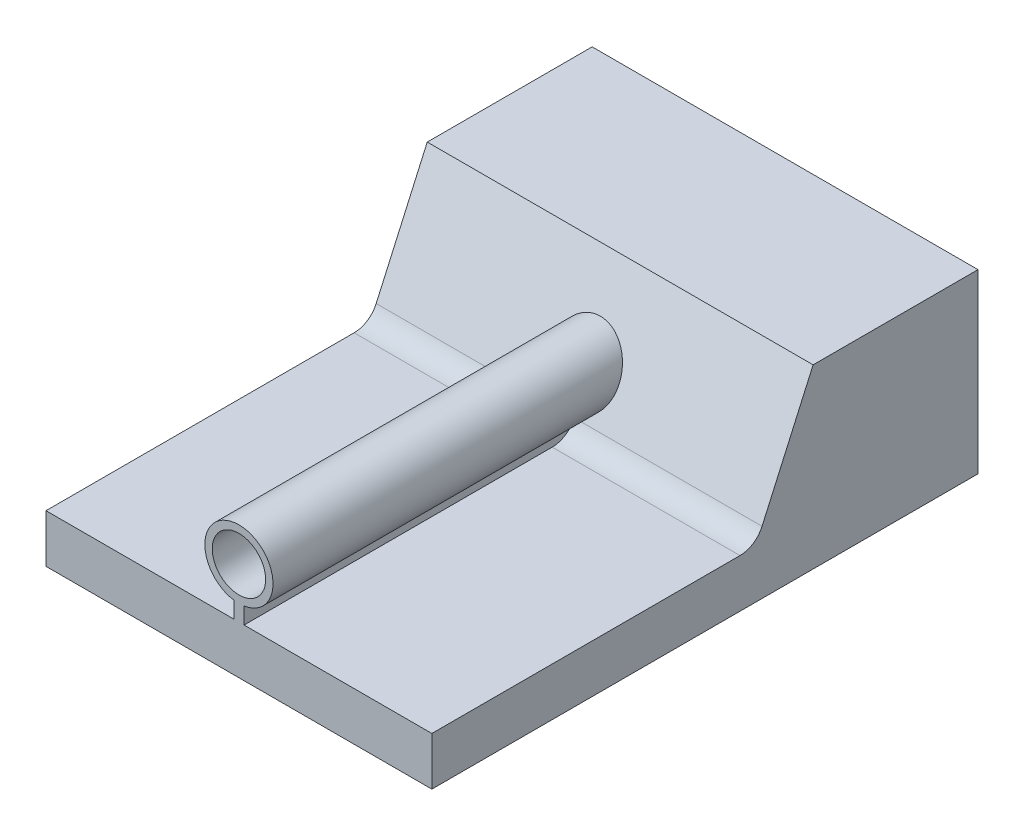
ISO-10303-21;
HEADER;
FILE_DESCRIPTION(('STEP AP214'),'2;1');
FILE_NAME('part.step','',(''),(''),'','','');
FILE_SCHEMA(('AUTOMOTIVE_DESIGN { 1 0 10303 214 1 1 1 1 }'));
ENDSEC;
DATA;
#1=APPLICATION_CONTEXT('core data for automotive mechanical design processes');
#2=APPLICATION_PROTOCOL_DEFINITION('international standard','automotive_design',2000,#1);
#3=PRODUCT_CONTEXT('',#1,'mechanical');
#4=PRODUCT('Part','Part','',(#3));
#5=PRODUCT_RELATED_PRODUCT_CATEGORY('part','',(#4));
#6=PRODUCT_DEFINITION_FORMATION('','',#4);
#7=PRODUCT_DEFINITION_CONTEXT('part definition',#1,'design');
#8=PRODUCT_DEFINITION('design','',#6,#7);
#9=PRODUCT_DEFINITION_SHAPE('','',#8);
#10=(LENGTH_UNIT() NAMED_UNIT(*) SI_UNIT(.MILLI.,.METRE.));
#11=(NAMED_UNIT(*) PLANE_ANGLE_UNIT() SI_UNIT($,.RADIAN.));
#12=(NAMED_UNIT(*) SI_UNIT($,.STERADIAN.) SOLID_ANGLE_UNIT());
#13=UNCERTAINTY_MEASURE_WITH_UNIT(LENGTH_MEASURE(1.E-05),#10,'distance_accuracy_value','');
#14=(GEOMETRIC_REPRESENTATION_CONTEXT(3) GLOBAL_UNCERTAINTY_ASSIGNED_CONTEXT((#13)) GLOBAL_UNIT_ASSIGNED_CONTEXT((#10,
#11,#12)) REPRESENTATION_CONTEXT('',''));
#15=CARTESIAN_POINT('',(0.,0.,0.));
#16=DIRECTION('',(0.,0.,1.));
#17=DIRECTION('',(1.,0.,0.));
#18=AXIS2_PLACEMENT_3D('',#15,#16,#17);
#19=CARTESIAN_POINT('',(76.2,9.52500000000001,-63.9427846483465));
#20=DIRECTION('',(0.,-1.,0.));
#21=DIRECTION('',(0.,0.,-1.));
#22=AXIS2_PLACEMENT_3D('',#19,#20,#21);
#23=PLANE('',#22);
#24=DIRECTION('',(0.,0.,1.));
#25=VECTOR('',#24,1.);
#26=CARTESIAN_POINT('',(37.084,9.525,-500000.));
#27=LINE('',#26,#25);
#28=CARTESIAN_POINT('',(37.084,9.525,-60.8457597954271));
#29=VERTEX_POINT('',#28);
#30=CARTESIAN_POINT('',(37.084,9.525,0.));
#31=VERTEX_POINT('',#30);
#32=EDGE_CURVE('E206',#29,#31,#27,.T.);
#33=ORIENTED_EDGE('',*,*,#32,.F.);
#34=DIRECTION('',(-1.,0.,0.));
#35=VECTOR('',#34,1.);
#36=CARTESIAN_POINT('',(0.,9.52500000000001,-60.8457597953329));
#37=LINE('',#36,#35);
#38=CARTESIAN_POINT('',(0.,9.52500000000001,-60.8457597953329));
#39=VERTEX_POINT('',#38);
#40=EDGE_CURVE('E253',#29,#39,#37,.T.);
#41=ORIENTED_EDGE('',*,*,#40,.T.);
#42=DIRECTION('',(0.,0.,1.));
#43=VECTOR('',#42,1.);
#44=CARTESIAN_POINT('',(0.,9.52500000000001,-63.9427846483465));
#45=LINE('',#44,#43);
#46=CARTESIAN_POINT('',(0.,9.525,0.));
#47=VERTEX_POINT('',#46);
#48=EDGE_CURVE('E213',#39,#47,#45,.T.);
#49=ORIENTED_EDGE('',*,*,#48,.T.);
#50=DIRECTION('',(-1.,0.,0.));
#51=VECTOR('',#50,1.);
#52=CARTESIAN_POINT('',(76.2,9.525,0.));
#53=LINE('',#52,#51);
#54=EDGE_CURVE('E223',#31,#47,#53,.T.);
#55=ORIENTED_EDGE('',*,*,#54,.F.);
#56=EDGE_LOOP('',(#33,#41,#49,#55));
#57=FACE_BOUND('',#56,.T.);
#58=ADVANCED_FACE('F52',(#57),#23,.F.);
#59=CARTESIAN_POINT('',(76.2,9.525,0.));
#60=DIRECTION('',(0.,0.,-1.));
#61=DIRECTION('',(0.,1.,0.));
#62=AXIS2_PLACEMENT_3D('',#59,#60,#61);
#63=PLANE('',#62);
#64=DIRECTION('',(0.,-1.,0.));
#65=VECTOR('',#64,1.);
#66=CARTESIAN_POINT('',(0.,9.525,0.));
#67=LINE('',#66,#65);
#68=CARTESIAN_POINT('',(0.,0.,0.));
#69=VERTEX_POINT('',#68);
#70=EDGE_CURVE('E194',#47,#69,#67,.T.);
#71=ORIENTED_EDGE('',*,*,#70,.T.);
#72=DIRECTION('',(-1.,0.,0.));
#73=VECTOR('',#72,1.);
#74=CARTESIAN_POINT('',(76.2,0.,0.));
#75=LINE('',#74,#73);
#76=CARTESIAN_POINT('',(76.2,0.,0.));
#77=VERTEX_POINT('',#76);
#78=EDGE_CURVE('E247',#77,#69,#75,.T.);
#79=ORIENTED_EDGE('',*,*,#78,.F.);
#80=DIRECTION('',(0.,-1.,0.));
#81=VECTOR('',#80,1.);
#82=CARTESIAN_POINT('',(76.2,9.525,0.));
#83=LINE('',#82,#81);
#84=CARTESIAN_POINT('',(76.2,9.525,0.));
#85=VERTEX_POINT('',#84);
#86=EDGE_CURVE('E209',#85,#77,#83,.T.);
#87=ORIENTED_EDGE('',*,*,#86,.F.);
#88=CARTESIAN_POINT('',(39.116,9.525,0.));
#89=VERTEX_POINT('',#88);
#90=EDGE_CURVE('E235',#85,#89,#53,.T.);
#91=ORIENTED_EDGE('',*,*,#90,.T.);
#92=DIRECTION('',(0.,1.,0.));
#93=VECTOR('',#92,1.);
#94=CARTESIAN_POINT('',(39.116,9.525,0.));
#95=LINE('',#94,#93);
#96=CARTESIAN_POINT('',(39.116,12.7,0.));
#97=VERTEX_POINT('',#96);
#98=EDGE_CURVE('E192',#89,#97,#95,.T.);
#99=ORIENTED_EDGE('',*,*,#98,.T.);
#100=DIRECTION('',(0.,1.,0.));
#101=VECTOR('',#100,1.);
#102=CARTESIAN_POINT('',(39.116,12.7,0.));
#103=LINE('',#102,#101);
#104=CARTESIAN_POINT('',(39.116,12.7771180976714,0.));
#105=VERTEX_POINT('',#104);
#106=EDGE_CURVE('E167',#97,#105,#103,.T.);
#107=ORIENTED_EDGE('',*,*,#106,.T.);
#108=CARTESIAN_POINT('',(38.1,19.4312552587326,0.));
#109=DIRECTION('',(0.,0.,1.));
#110=DIRECTION('',(1.,0.,0.));
#111=AXIS2_PLACEMENT_3D('',#108,#109,#110);
#112=CIRCLE('',#111,6.73125525873262);
#113=CARTESIAN_POINT('',(37.084,12.7771180976714,0.));
#114=VERTEX_POINT('',#113);
#115=EDGE_CURVE('E191',#105,#114,#112,.T.);
#116=ORIENTED_EDGE('',*,*,#115,.T.);
#117=DIRECTION('',(0.,-1.,0.));
#118=VECTOR('',#117,1.);
#119=CARTESIAN_POINT('',(37.084,12.7,0.));
#120=LINE('',#119,#118);
#121=CARTESIAN_POINT('',(37.084,12.7,0.));
#122=VERTEX_POINT('',#121);
#123=EDGE_CURVE('E187',#114,#122,#120,.T.);
#124=ORIENTED_EDGE('',*,*,#123,.T.);
#125=DIRECTION('',(0.,-1.,0.));
#126=VECTOR('',#125,1.);
#127=CARTESIAN_POINT('',(37.084,9.525,0.));
#128=LINE('',#127,#126);
#129=EDGE_CURVE('E184',#122,#31,#128,.T.);
#130=ORIENTED_EDGE('',*,*,#129,.T.);
#131=ORIENTED_EDGE('',*,*,#54,.T.);
#132=EDGE_LOOP('',(#71,#79,#87,#91,#99,#107,#116,#124,#130,#131));
#133=FACE_BOUND('',#132,.T.);
#134=CARTESIAN_POINT('',(38.1,19.4312552587326,0.));
#135=DIRECTION('',(0.,0.,1.));
#136=DIRECTION('',(1.,0.,0.));
#137=AXIS2_PLACEMENT_3D('',#134,#135,#136);
#138=CIRCLE('',#137,5.26879567345299);
#139=CARTESIAN_POINT('',(43.368795673453,19.4312552587326,0.));
#140=VERTEX_POINT('',#139);
#141=EDGE_CURVE('E188',#140,#140,#138,.T.);
#142=ORIENTED_EDGE('',*,*,#141,.F.);
#143=EDGE_LOOP('',(#142));
#144=FACE_BOUND('',#143,.T.);
#145=ADVANCED_FACE('F287',(#133,#144),#63,.F.);
#146=CARTESIAN_POINT('',(76.2,0.,0.));
#147=DIRECTION('',(0.,1.,0.));
#148=DIRECTION('',(0.,0.,1.));
#149=AXIS2_PLACEMENT_3D('',#146,#147,#148);
#150=PLANE('',#149);
#151=DIRECTION('',(0.,0.,-1.));
#152=VECTOR('',#151,1.);
#153=CARTESIAN_POINT('',(0.,0.,0.));
#154=LINE('',#153,#152);
#155=CARTESIAN_POINT('',(0.,0.,-107.851907976239));
#156=VERTEX_POINT('',#155);
#157=EDGE_CURVE('E226',#69,#156,#154,.T.);
#158=ORIENTED_EDGE('',*,*,#157,.T.);
#159=DIRECTION('',(-1.,0.,0.));
#160=VECTOR('',#159,1.);
#161=CARTESIAN_POINT('',(76.2,0.,-107.851907976239));
#162=LINE('',#161,#160);
#163=CARTESIAN_POINT('',(76.2,0.,-107.851907976239));
#164=VERTEX_POINT('',#163);
#165=EDGE_CURVE('E244',#164,#156,#162,.T.);
#166=ORIENTED_EDGE('',*,*,#165,.F.);
#167=DIRECTION('',(0.,0.,-1.));
#168=VECTOR('',#167,1.);
#169=CARTESIAN_POINT('',(76.2,0.,0.));
#170=LINE('',#169,#168);
#171=EDGE_CURVE('E212',#77,#164,#170,.T.);
#172=ORIENTED_EDGE('',*,*,#171,.F.);
#173=ORIENTED_EDGE('',*,*,#78,.T.);
#174=EDGE_LOOP('',(#158,#166,#172,#173));
#175=FACE_BOUND('',#174,.T.);
#176=ADVANCED_FACE('F293',(#175),#150,.F.);
#177=CARTESIAN_POINT('',(76.2,0.,-107.851907976239));
#178=DIRECTION('',(0.,0.,1.));
#179=DIRECTION('',(1.,0.,0.));
#180=AXIS2_PLACEMENT_3D('',#177,#178,#179);
#181=PLANE('',#180);
#182=DIRECTION('',(0.,1.,0.));
#183=VECTOR('',#182,1.);
#184=CARTESIAN_POINT('',(0.,0.,-107.851907976239));
#185=LINE('',#184,#183);
#186=CARTESIAN_POINT('',(0.,34.925,-107.851907976239));
#187=VERTEX_POINT('',#186);
#188=EDGE_CURVE('E228',#156,#187,#185,.T.);
#189=ORIENTED_EDGE('',*,*,#188,.T.);
#190=DIRECTION('',(-1.,0.,0.));
#191=VECTOR('',#190,1.);
#192=CARTESIAN_POINT('',(76.2,34.925,-107.851907976239));
#193=LINE('',#192,#191);
#194=CARTESIAN_POINT('',(76.2,34.925,-107.851907976239));
#195=VERTEX_POINT('',#194);
#196=EDGE_CURVE('E241',#195,#187,#193,.T.);
#197=ORIENTED_EDGE('',*,*,#196,.F.);
#198=DIRECTION('',(0.,1.,0.));
#199=VECTOR('',#198,1.);
#200=CARTESIAN_POINT('',(76.2,0.,-107.851907976239));
#201=LINE('',#200,#199);
#202=EDGE_CURVE('E215',#164,#195,#201,.T.);
#203=ORIENTED_EDGE('',*,*,#202,.F.);
#204=ORIENTED_EDGE('',*,*,#165,.T.);
#205=EDGE_LOOP('',(#189,#197,#203,#204));
#206=FACE_BOUND('',#205,.T.);
#207=ADVANCED_FACE('F333',(#206),#181,.F.);
#208=CARTESIAN_POINT('',(76.2,34.925,-107.851907976239));
#209=DIRECTION('',(0.,-1.,0.));
#210=DIRECTION('',(0.,0.,-1.));
#211=AXIS2_PLACEMENT_3D('',#208,#209,#210);
#212=PLANE('',#211);
#213=DIRECTION('',(0.,0.,1.));
#214=VECTOR('',#213,1.);
#215=CARTESIAN_POINT('',(0.,34.925,-107.851907976239));
#216=LINE('',#215,#214);
#217=CARTESIAN_POINT('',(0.,34.925,-75.2877256038785));
#218=VERTEX_POINT('',#217);
#219=EDGE_CURVE('E230',#187,#218,#216,.T.);
#220=ORIENTED_EDGE('',*,*,#219,.T.);
#221=DIRECTION('',(-1.,0.,0.));
#222=VECTOR('',#221,1.);
#223=CARTESIAN_POINT('',(76.2,34.925,-75.2877256038785));
#224=LINE('',#223,#222);
#225=CARTESIAN_POINT('',(76.2,34.925,-75.2877256038785));
#226=VERTEX_POINT('',#225);
#227=EDGE_CURVE('E238',#226,#218,#224,.T.);
#228=ORIENTED_EDGE('',*,*,#227,.F.);
#229=DIRECTION('',(0.,0.,1.));
#230=VECTOR('',#229,1.);
#231=CARTESIAN_POINT('',(76.2,34.925,-107.851907976239));
#232=LINE('',#231,#230);
#233=EDGE_CURVE('E217',#195,#226,#232,.T.);
#234=ORIENTED_EDGE('',*,*,#233,.F.);
#235=ORIENTED_EDGE('',*,*,#196,.T.);
#236=EDGE_LOOP('',(#220,#228,#234,#235));
#237=FACE_BOUND('',#236,.T.);
#238=ADVANCED_FACE('F329',(#237),#212,.F.);
#239=CARTESIAN_POINT('',(76.2,34.925,-75.2877256038785));
#240=DIRECTION('',(0.,-0.407820341467668,-0.913062193437662));
#241=DIRECTION('',(0.,0.913062193437662,-0.407820341467668));
#242=AXIS2_PLACEMENT_3D('',#239,#240,#241);
#243=PLANE('',#242);
#244=DIRECTION('',(0.,-0.913062193437662,0.407820341467668));
#245=VECTOR('',#244,1.);
#246=CARTESIAN_POINT('',(0.,34.925,-75.2877256038785));
#247=LINE('',#246,#245);
#248=CARTESIAN_POINT('',(0.,12.3527763054236,-65.2058143814364));
#249=VERTEX_POINT('',#248);
#250=EDGE_CURVE('E232',#218,#249,#247,.T.);
#251=ORIENTED_EDGE('',*,*,#250,.T.);
#252=DIRECTION('',(-1.,0.,0.));
#253=VECTOR('',#252,1.);
#254=CARTESIAN_POINT('',(37.084,12.3527763054236,-65.2058143814364));
#255=LINE('',#254,#253);
#256=CARTESIAN_POINT('',(37.084,12.3527763054199,-65.2058143814145));
#257=VERTEX_POINT('',#256);
#258=EDGE_CURVE('E258',#249,#257,#255,.F.);
#259=ORIENTED_EDGE('',*,*,#258,.T.);
#260=DIRECTION('',(0.,-0.913062193437662,0.407820341467668));
#261=VECTOR('',#260,1.);
#262=CARTESIAN_POINT('',(37.084,186168.382678024,-83212.0234423826));
#263=LINE('',#262,#261);
#264=CARTESIAN_POINT('',(37.084,12.6999999999834,-65.3609022678054));
#265=VERTEX_POINT('',#264);
#266=EDGE_CURVE('E170',#265,#257,#263,.T.);
#267=ORIENTED_EDGE('',*,*,#266,.F.);
#268=DIRECTION('',(0.,-0.913062193437662,0.407820341467668));
#269=VECTOR('',#268,1.);
#270=CARTESIAN_POINT('',(37.084,186171.02962018,-83213.2057023229));
#271=LINE('',#270,#269);
#272=CARTESIAN_POINT('',(37.084,12.7771180976654,-65.3953471601696));
#273=VERTEX_POINT('',#272);
#274=EDGE_CURVE('E178',#273,#265,#271,.T.);
#275=ORIENTED_EDGE('',*,*,#274,.F.);
#276=CARTESIAN_POINT('',(38.1,19.4312552587326,-68.367425632573));
#277=DIRECTION('',(0.,-0.407820341467668,-0.913062193437662));
#278=DIRECTION('',(0.,-0.913062193437662,0.407820341467668));
#279=AXIS2_PLACEMENT_3D('',#276,#277,#278);
#280=ELLIPSE('',#279,7.37217607640677,6.73125525873262);
#281=CARTESIAN_POINT('',(39.116,12.7771180976714,-65.395347160063));
#282=VERTEX_POINT('',#281);
#283=EDGE_CURVE('E176',#282,#273,#280,.F.);
#284=ORIENTED_EDGE('',*,*,#283,.F.);
#285=DIRECTION('',(0.,0.913062193437662,-0.407820341467668));
#286=VECTOR('',#285,1.);
#287=CARTESIAN_POINT('',(39.116,186171.02962018,-83213.2057023229));
#288=LINE('',#287,#286);
#289=CARTESIAN_POINT('',(39.116,12.6999999999976,-65.3609022678623));
#290=VERTEX_POINT('',#289);
#291=EDGE_CURVE('E161',#290,#282,#288,.T.);
#292=ORIENTED_EDGE('',*,*,#291,.F.);
#293=DIRECTION('',(0.,0.913062193437662,-0.407820341467668));
#294=VECTOR('',#293,1.);
#295=CARTESIAN_POINT('',(39.116,186168.382678024,-83212.0234423826));
#296=LINE('',#295,#294);
#297=CARTESIAN_POINT('',(39.116,12.3527763054199,-65.2058143814145));
#298=VERTEX_POINT('',#297);
#299=EDGE_CURVE('E152',#298,#290,#296,.T.);
#300=ORIENTED_EDGE('',*,*,#299,.F.);
#301=DIRECTION('',(-1.,0.,0.));
#302=VECTOR('',#301,1.);
#303=CARTESIAN_POINT('',(76.2,12.3527763054236,-65.2058143814364));
#304=LINE('',#303,#302);
#305=CARTESIAN_POINT('',(76.2,12.3527763054236,-65.2058143814364));
#306=VERTEX_POINT('',#305);
#307=EDGE_CURVE('E256',#298,#306,#304,.F.);
#308=ORIENTED_EDGE('',*,*,#307,.T.);
#309=DIRECTION('',(0.,-0.913062193437662,0.407820341467668));
#310=VECTOR('',#309,1.);
#311=CARTESIAN_POINT('',(76.2,34.925,-75.2877256038785));
#312=LINE('',#311,#310);
#313=EDGE_CURVE('E219',#226,#306,#312,.T.);
#314=ORIENTED_EDGE('',*,*,#313,.F.);
#315=ORIENTED_EDGE('',*,*,#227,.T.);
#316=EDGE_LOOP('',(#251,#259,#267,#275,#284,#292,#300,#308,#314,#315));
#317=FACE_BOUND('',#316,.T.);
#318=ADVANCED_FACE('F174',(#317),#243,.F.);
#319=DIRECTION('',(0.,0.,1.));
#320=VECTOR('',#319,1.);
#321=CARTESIAN_POINT('',(76.2,9.52500000000001,-63.9427846483465));
#322=LINE('',#321,#320);
#323=CARTESIAN_POINT('',(76.2,9.52500000000001,-60.8457597953329));
#324=VERTEX_POINT('',#323);
#325=EDGE_CURVE('E221',#324,#85,#322,.T.);
#326=ORIENTED_EDGE('',*,*,#325,.F.);
#327=DIRECTION('',(-1.,0.,0.));
#328=VECTOR('',#327,1.);
#329=CARTESIAN_POINT('',(39.116,9.52500000000001,-60.8457597953329));
#330=LINE('',#329,#328);
#331=CARTESIAN_POINT('',(39.116,9.525,-60.8457597954271));
#332=VERTEX_POINT('',#331);
#333=EDGE_CURVE('E262',#324,#332,#330,.T.);
#334=ORIENTED_EDGE('',*,*,#333,.T.);
#335=DIRECTION('',(0.,0.,1.));
#336=VECTOR('',#335,1.);
#337=CARTESIAN_POINT('',(39.116,9.525,-500000.));
#338=LINE('',#337,#336);
#339=EDGE_CURVE('E199',#332,#89,#338,.T.);
#340=ORIENTED_EDGE('',*,*,#339,.T.);
#341=ORIENTED_EDGE('',*,*,#90,.F.);
#342=EDGE_LOOP('',(#326,#334,#340,#341));
#343=FACE_BOUND('',#342,.T.);
#344=ADVANCED_FACE('F298',(#343),#23,.F.);
#345=CARTESIAN_POINT('',(76.2,0.,0.));
#346=DIRECTION('',(1.,0.,0.));
#347=DIRECTION('',(0.,0.,-1.));
#348=AXIS2_PLACEMENT_3D('',#345,#346,#347);
#349=PLANE('',#348);
#350=ORIENTED_EDGE('',*,*,#86,.T.);
#351=ORIENTED_EDGE('',*,*,#171,.T.);
#352=ORIENTED_EDGE('',*,*,#202,.T.);
#353=ORIENTED_EDGE('',*,*,#233,.T.);
#354=ORIENTED_EDGE('',*,*,#313,.T.);
#355=CARTESIAN_POINT('',(76.2,14.3002,-60.8457597953329));
#356=DIRECTION('',(1.,0.,0.));
#357=DIRECTION('',(0.,0.,-1.));
#358=AXIS2_PLACEMENT_3D('',#355,#356,#357);
#359=CIRCLE('',#358,4.7752);
#360=EDGE_CURVE('E12',#306,#324,#359,.F.);
#361=ORIENTED_EDGE('',*,*,#360,.T.);
#362=ORIENTED_EDGE('',*,*,#325,.T.);
#363=EDGE_LOOP('',(#350,#351,#352,#353,#354,#361,#362));
#364=FACE_BOUND('',#363,.T.);
#365=ADVANCED_FACE('F296',(#364),#349,.T.);
#366=CARTESIAN_POINT('',(0.,0.,0.));
#367=DIRECTION('',(1.,0.,0.));
#368=DIRECTION('',(0.,0.,-1.));
#369=AXIS2_PLACEMENT_3D('',#366,#367,#368);
#370=PLANE('',#369);
#371=ORIENTED_EDGE('',*,*,#70,.F.);
#372=ORIENTED_EDGE('',*,*,#48,.F.);
#373=CARTESIAN_POINT('',(0.,14.3002,-60.8457597953329));
#374=DIRECTION('',(1.,0.,0.));
#375=DIRECTION('',(0.,0.,-1.));
#376=AXIS2_PLACEMENT_3D('',#373,#374,#375);
#377=CIRCLE('',#376,4.7752);
#378=EDGE_CURVE('E60',#39,#249,#377,.T.);
#379=ORIENTED_EDGE('',*,*,#378,.T.);
#380=ORIENTED_EDGE('',*,*,#250,.F.);
#381=ORIENTED_EDGE('',*,*,#219,.F.);
#382=ORIENTED_EDGE('',*,*,#188,.F.);
#383=ORIENTED_EDGE('',*,*,#157,.F.);
#384=EDGE_LOOP('',(#371,#372,#379,#380,#381,#382,#383));
#385=FACE_BOUND('',#384,.T.);
#386=ADVANCED_FACE('F268',(#385),#370,.F.);
#387=CARTESIAN_POINT('',(37.084,9.525,-500000.));
#388=DIRECTION('',(-1.,0.,0.));
#389=DIRECTION('',(0.,0.,1.));
#390=AXIS2_PLACEMENT_3D('',#387,#388,#389);
#391=PLANE('',#390);
#392=ORIENTED_EDGE('',*,*,#266,.T.);
#393=CARTESIAN_POINT('',(37.084,14.3002,-60.8457597953329));
#394=DIRECTION('',(-1.,0.,0.));
#395=DIRECTION('',(0.,0.,1.));
#396=AXIS2_PLACEMENT_3D('',#393,#394,#395);
#397=CIRCLE('',#396,4.7752);
#398=EDGE_CURVE('E260',#257,#29,#397,.T.);
#399=ORIENTED_EDGE('',*,*,#398,.T.);
#400=ORIENTED_EDGE('',*,*,#32,.T.);
#401=ORIENTED_EDGE('',*,*,#129,.F.);
#402=DIRECTION('',(0.,0.,1.));
#403=VECTOR('',#402,1.);
#404=CARTESIAN_POINT('',(37.084,12.7,-500000.));
#405=LINE('',#404,#403);
#406=EDGE_CURVE('E204',#265,#122,#405,.T.);
#407=ORIENTED_EDGE('',*,*,#406,.F.);
#408=EDGE_LOOP('',(#392,#399,#400,#401,#407));
#409=FACE_BOUND('',#408,.T.);
#410=ADVANCED_FACE('F280',(#409),#391,.T.);
#411=CARTESIAN_POINT('',(37.084,12.7,-500000.));
#412=DIRECTION('',(-1.,0.,0.));
#413=DIRECTION('',(0.,0.,1.));
#414=AXIS2_PLACEMENT_3D('',#411,#412,#413);
#415=PLANE('',#414);
#416=DIRECTION('',(0.,0.,1.));
#417=VECTOR('',#416,1.);
#418=CARTESIAN_POINT('',(37.084,12.7771180976714,-500000.));
#419=LINE('',#418,#417);
#420=EDGE_CURVE('E202',#273,#114,#419,.T.);
#421=ORIENTED_EDGE('',*,*,#420,.F.);
#422=ORIENTED_EDGE('',*,*,#274,.T.);
#423=ORIENTED_EDGE('',*,*,#406,.T.);
#424=ORIENTED_EDGE('',*,*,#123,.F.);
#425=EDGE_LOOP('',(#421,#422,#423,#424));
#426=FACE_BOUND('',#425,.T.);
#427=ADVANCED_FACE('F305',(#426),#415,.T.);
#428=CARTESIAN_POINT('',(38.1,19.4312552587326,-500000.));
#429=DIRECTION('',(0.,0.,1.));
#430=DIRECTION('',(1.,0.,0.));
#431=AXIS2_PLACEMENT_3D('',#428,#429,#430);
#432=CYLINDRICAL_SURFACE('',#431,6.73125525873262);
#433=DIRECTION('',(0.,0.,1.));
#434=VECTOR('',#433,1.);
#435=CARTESIAN_POINT('',(39.116,12.7771180976714,-500000.));
#436=LINE('',#435,#434);
#437=EDGE_CURVE('E169',#282,#105,#436,.T.);
#438=ORIENTED_EDGE('',*,*,#437,.F.);
#439=ORIENTED_EDGE('',*,*,#283,.T.);
#440=ORIENTED_EDGE('',*,*,#420,.T.);
#441=ORIENTED_EDGE('',*,*,#115,.F.);
#442=EDGE_LOOP('',(#438,#439,#440,#441));
#443=FACE_BOUND('',#442,.T.);
#444=ADVANCED_FACE('F302',(#443),#432,.T.);
#445=CARTESIAN_POINT('',(39.116,12.7,-500000.));
#446=DIRECTION('',(1.,0.,0.));
#447=DIRECTION('',(0.,0.,-1.));
#448=AXIS2_PLACEMENT_3D('',#445,#446,#447);
#449=PLANE('',#448);
#450=DIRECTION('',(0.,0.,1.));
#451=VECTOR('',#450,1.);
#452=CARTESIAN_POINT('',(39.116,12.7,-500000.));
#453=LINE('',#452,#451);
#454=EDGE_CURVE('E157',#290,#97,#453,.T.);
#455=ORIENTED_EDGE('',*,*,#454,.F.);
#456=ORIENTED_EDGE('',*,*,#291,.T.);
#457=ORIENTED_EDGE('',*,*,#437,.T.);
#458=ORIENTED_EDGE('',*,*,#106,.F.);
#459=EDGE_LOOP('',(#455,#456,#457,#458));
#460=FACE_BOUND('',#459,.T.);
#461=ADVANCED_FACE('F164',(#460),#449,.T.);
#462=CARTESIAN_POINT('',(39.116,9.525,-500000.));
#463=DIRECTION('',(1.,0.,0.));
#464=DIRECTION('',(0.,0.,-1.));
#465=AXIS2_PLACEMENT_3D('',#462,#463,#464);
#466=PLANE('',#465);
#467=ORIENTED_EDGE('',*,*,#339,.F.);
#468=CARTESIAN_POINT('',(39.116,14.3002,-60.8457597953329));
#469=DIRECTION('',(1.,0.,0.));
#470=DIRECTION('',(0.,0.,-1.));
#471=AXIS2_PLACEMENT_3D('',#468,#469,#470);
#472=CIRCLE('',#471,4.7752);
#473=EDGE_CURVE('E73',#332,#298,#472,.T.);
#474=ORIENTED_EDGE('',*,*,#473,.T.);
#475=ORIENTED_EDGE('',*,*,#299,.T.);
#476=ORIENTED_EDGE('',*,*,#454,.T.);
#477=ORIENTED_EDGE('',*,*,#98,.F.);
#478=EDGE_LOOP('',(#467,#474,#475,#476,#477));
#479=FACE_BOUND('',#478,.T.);
#480=ADVANCED_FACE('F155',(#479),#466,.T.);
#481=CARTESIAN_POINT('',(38.1,19.4312552587326,-500000.));
#482=DIRECTION('',(0.,0.,1.));
#483=DIRECTION('',(1.,0.,0.));
#484=AXIS2_PLACEMENT_3D('',#481,#482,#483);
#485=CYLINDRICAL_SURFACE('',#484,5.26879567345299);
#486=ORIENTED_EDGE('',*,*,#141,.T.);
#487=EDGE_LOOP('',(#486));
#488=FACE_BOUND('',#487,.T.);
#489=CARTESIAN_POINT('',(38.1,19.4312552587326,-68.367425632573));
#490=DIRECTION('',(0.,-0.407820341467668,-0.913062193437662));
#491=DIRECTION('',(0.,-0.913062193437662,0.407820341467668));
#492=AXIS2_PLACEMENT_3D('',#489,#490,#491);
#493=ELLIPSE('',#492,5.77046745700429,5.26879567345299);
#494=CARTESIAN_POINT('',(38.1,14.1624595852796,-66.0141116238295));
#495=VERTEX_POINT('',#494);
#496=EDGE_CURVE('E250',#495,#495,#493,.T.);
#497=ORIENTED_EDGE('',*,*,#496,.T.);
#498=EDGE_LOOP('',(#497));
#499=FACE_BOUND('',#498,.T.);
#500=ADVANCED_FACE('F337',(#488,#499),#485,.F.);
#501=ORIENTED_EDGE('',*,*,#496,.F.);
#502=EDGE_LOOP('',(#501));
#503=FACE_BOUND('',#502,.T.);
#504=ADVANCED_FACE('F314',(#503),#243,.F.);
#505=CARTESIAN_POINT('',(76.2,14.3002,-60.8457597953329));
#506=DIRECTION('',(1.,0.,0.));
#507=DIRECTION('',(0.,0.,-1.));
#508=AXIS2_PLACEMENT_3D('',#505,#506,#507);
#509=CYLINDRICAL_SURFACE('',#508,4.7752);
#510=ORIENTED_EDGE('',*,*,#398,.F.);
#511=ORIENTED_EDGE('',*,*,#258,.F.);
#512=ORIENTED_EDGE('',*,*,#378,.F.);
#513=ORIENTED_EDGE('',*,*,#40,.F.);
#514=EDGE_LOOP('',(#510,#511,#512,#513));
#515=FACE_BOUND('',#514,.T.);
#516=ADVANCED_FACE('F277',(#515),#509,.F.);
#517=CARTESIAN_POINT('',(76.2,14.3002,-60.8457597953329));
#518=DIRECTION('',(1.,0.,0.));
#519=DIRECTION('',(0.,0.,-1.));
#520=AXIS2_PLACEMENT_3D('',#517,#518,#519);
#521=CYLINDRICAL_SURFACE('',#520,4.7752);
#522=ORIENTED_EDGE('',*,*,#360,.F.);
#523=ORIENTED_EDGE('',*,*,#307,.F.);
#524=ORIENTED_EDGE('',*,*,#473,.F.);
#525=ORIENTED_EDGE('',*,*,#333,.F.);
#526=EDGE_LOOP('',(#522,#523,#524,#525));
#527=FACE_BOUND('',#526,.T.);
#528=ADVANCED_FACE('F54',(#527),#521,.F.);
#529=CLOSED_SHELL('',(#58,#145,#176,#207,#238,#318,#344,#365,#386,#410,#427,#444,#461,#480,#500,
#504,#516,#528));
#530=MANIFOLD_SOLID_BREP('B2',#529);
#531=ADVANCED_BREP_SHAPE_REPRESENTATION('',(#18,#530),#14);
#532=SHAPE_DEFINITION_REPRESENTATION(#9,#531);
ENDSEC;
END-ISO-10303-21;
